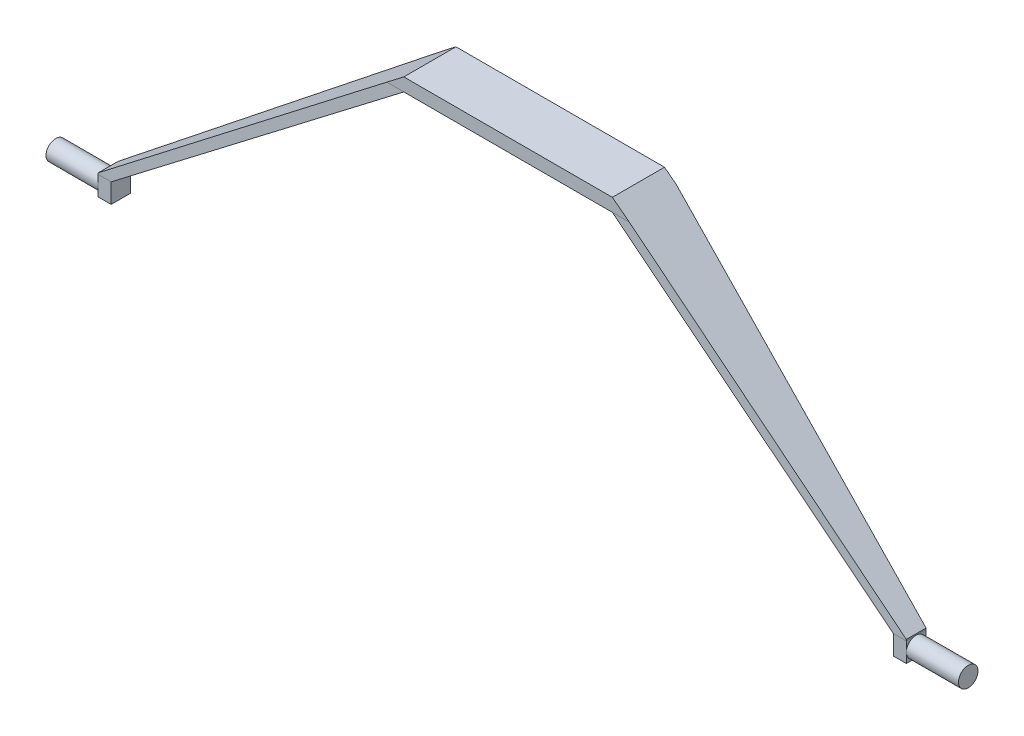
ISO-10303-21;
HEADER;
FILE_DESCRIPTION(('STEP AP214'),'2;1');
FILE_NAME('part.step','',(''),(''),'','','');
FILE_SCHEMA(('AUTOMOTIVE_DESIGN { 1 0 10303 214 1 1 1 1 }'));
ENDSEC;
DATA;
#1=APPLICATION_CONTEXT('core data for automotive mechanical design processes');
#2=APPLICATION_PROTOCOL_DEFINITION('international standard','automotive_design',2000,#1);
#3=PRODUCT_CONTEXT('',#1,'mechanical');
#4=PRODUCT('Part','Part','',(#3));
#5=PRODUCT_RELATED_PRODUCT_CATEGORY('part','',(#4));
#6=PRODUCT_DEFINITION_FORMATION('','',#4);
#7=PRODUCT_DEFINITION_CONTEXT('part definition',#1,'design');
#8=PRODUCT_DEFINITION('design','',#6,#7);
#9=PRODUCT_DEFINITION_SHAPE('','',#8);
#10=(LENGTH_UNIT() NAMED_UNIT(*) SI_UNIT(.MILLI.,.METRE.));
#11=(NAMED_UNIT(*) PLANE_ANGLE_UNIT() SI_UNIT($,.RADIAN.));
#12=(NAMED_UNIT(*) SI_UNIT($,.STERADIAN.) SOLID_ANGLE_UNIT());
#13=UNCERTAINTY_MEASURE_WITH_UNIT(LENGTH_MEASURE(1.E-05),#10,'distance_accuracy_value','');
#14=(GEOMETRIC_REPRESENTATION_CONTEXT(3) GLOBAL_UNCERTAINTY_ASSIGNED_CONTEXT((#13)) GLOBAL_UNIT_ASSIGNED_CONTEXT((#10,
#11,#12)) REPRESENTATION_CONTEXT('',''));
#15=CARTESIAN_POINT('',(0.,0.,0.));
#16=DIRECTION('',(0.,0.,1.));
#17=DIRECTION('',(1.,0.,0.));
#18=AXIS2_PLACEMENT_3D('',#15,#16,#17);
#19=CARTESIAN_POINT('',(0.,215.9,11.43));
#20=DIRECTION('',(0.,-1.,0.));
#21=DIRECTION('',(1.,0.,0.));
#22=AXIS2_PLACEMENT_3D('',#19,#20,#21);
#23=PLANE('',#22);
#24=DIRECTION('',(0.,0.,-1.));
#25=VECTOR('',#24,1.);
#26=CARTESIAN_POINT('',(-203.2,215.9,11.43));
#27=LINE('',#26,#25);
#28=CARTESIAN_POINT('',(-203.2,215.9,0.));
#29=VERTEX_POINT('',#28);
#30=CARTESIAN_POINT('',(-203.2,215.9,-100.20306796752));
#31=VERTEX_POINT('',#30);
#32=EDGE_CURVE('E192',#29,#31,#27,.T.);
#33=ORIENTED_EDGE('',*,*,#32,.T.);
#34=DIRECTION('',(-1.,0.,0.));
#35=VECTOR('',#34,1.);
#36=CARTESIAN_POINT('',(889.072484025787,215.9,-100.20306796752));
#37=LINE('',#36,#35);
#38=CARTESIAN_POINT('',(203.2,215.9,-100.20306796752));
#39=VERTEX_POINT('',#38);
#40=EDGE_CURVE('E172',#39,#31,#37,.T.);
#41=ORIENTED_EDGE('',*,*,#40,.F.);
#42=DIRECTION('',(0.,0.,-1.));
#43=VECTOR('',#42,1.);
#44=CARTESIAN_POINT('',(203.2,215.9,11.43));
#45=LINE('',#44,#43);
#46=CARTESIAN_POINT('',(203.2,215.9,0.));
#47=VERTEX_POINT('',#46);
#48=EDGE_CURVE('E11',#47,#39,#45,.T.);
#49=ORIENTED_EDGE('',*,*,#48,.F.);
#50=DIRECTION('',(1.,0.,0.));
#51=VECTOR('',#50,1.);
#52=CARTESIAN_POINT('',(889.072484025788,215.9,0.));
#53=LINE('',#52,#51);
#54=EDGE_CURVE('E200',#29,#47,#53,.T.);
#55=ORIENTED_EDGE('',*,*,#54,.F.);
#56=EDGE_LOOP('',(#33,#41,#49,#55));
#57=FACE_BOUND('',#56,.T.);
#58=ADVANCED_FACE('F41',(#57),#23,.T.);
#59=CARTESIAN_POINT('',(178.608653813682,234.620555922852,11.43));
#60=DIRECTION('',(-0.605721594983422,-0.795676661320878,0.));
#61=DIRECTION('',(0.795676661320878,-0.605721594983422,0.));
#62=AXIS2_PLACEMENT_3D('',#59,#60,#61);
#63=PLANE('',#62);
#64=ORIENTED_EDGE('',*,*,#48,.T.);
#65=DIRECTION('',(-0.791351832413663,0.602429249749417,-0.104121450152652));
#66=VECTOR('',#65,1.);
#67=CARTESIAN_POINT('',(841.604368216817,-270.09554436941,-16.2055514649283));
#68=LINE('',#67,#66);
#69=CARTESIAN_POINT('',(762.071663752112,-209.55,-26.67));
#70=VERTEX_POINT('',#69);
#71=EDGE_CURVE('E179',#70,#39,#68,.T.);
#72=ORIENTED_EDGE('',*,*,#71,.F.);
#73=DIRECTION('',(0.,0.,-1.));
#74=VECTOR('',#73,1.);
#75=CARTESIAN_POINT('',(762.071663752112,-209.55,11.43));
#76=LINE('',#75,#74);
#77=CARTESIAN_POINT('',(762.071663752112,-209.55,11.43));
#78=VERTEX_POINT('',#77);
#79=EDGE_CURVE('E49',#78,#70,#76,.T.);
#80=ORIENTED_EDGE('',*,*,#79,.F.);
#81=DIRECTION('',(0.795571328940657,-0.605641409022903,0.0162709632274809));
#82=VECTOR('',#81,1.);
#83=CARTESIAN_POINT('',(842.454767838912,-270.742924694243,13.0739890216364));
#84=LINE('',#83,#82);
#85=EDGE_CURVE('E267',#47,#78,#84,.T.);
#86=ORIENTED_EDGE('',*,*,#85,.F.);
#87=EDGE_LOOP('',(#64,#72,#80,#86));
#88=FACE_BOUND('',#87,.T.);
#89=ADVANCED_FACE('F266',(#88),#63,.T.);
#90=CARTESIAN_POINT('',(787.4,0.,11.43));
#91=DIRECTION('',(-1.,0.,0.));
#92=DIRECTION('',(0.,0.,1.));
#93=AXIS2_PLACEMENT_3D('',#90,#91,#92);
#94=PLANE('',#93);
#95=DIRECTION('',(0.,0.985390376076013,-0.170310911972118));
#96=VECTOR('',#95,1.);
#97=CARTESIAN_POINT('',(787.4,-209.55,-26.67));
#98=LINE('',#97,#96);
#99=CARTESIAN_POINT('',(787.4,-209.55,-26.67));
#100=VERTEX_POINT('',#99);
#101=CARTESIAN_POINT('',(787.4,-207.01,-27.1090033908509));
#102=VERTEX_POINT('',#101);
#103=EDGE_CURVE('E270',#100,#102,#98,.T.);
#104=ORIENTED_EDGE('',*,*,#103,.T.);
#105=DIRECTION('',(0.,0.,-1.));
#106=VECTOR('',#105,1.);
#107=CARTESIAN_POINT('',(787.4,-207.01,11.43));
#108=LINE('',#107,#106);
#109=CARTESIAN_POINT('',(787.4,-207.01,11.3617611940298));
#110=VERTEX_POINT('',#109);
#111=EDGE_CURVE('E237',#110,#102,#108,.T.);
#112=ORIENTED_EDGE('',*,*,#111,.F.);
#113=DIRECTION('',(0.,-0.999639313080089,0.0268559815454352));
#114=VECTOR('',#113,1.);
#115=CARTESIAN_POINT('',(787.4,-209.55,11.43));
#116=LINE('',#115,#114);
#117=CARTESIAN_POINT('',(787.4,-209.55,11.43));
#118=VERTEX_POINT('',#117);
#119=EDGE_CURVE('E309',#110,#118,#116,.T.);
#120=ORIENTED_EDGE('',*,*,#119,.T.);
#121=DIRECTION('',(0.,0.,-1.));
#122=VECTOR('',#121,1.);
#123=CARTESIAN_POINT('',(787.4,-209.55,11.43));
#124=LINE('',#123,#122);
#125=EDGE_CURVE('E241',#118,#100,#124,.T.);
#126=ORIENTED_EDGE('',*,*,#125,.T.);
#127=EDGE_LOOP('',(#104,#112,#120,#126));
#128=FACE_BOUND('',#127,.T.);
#129=ADVANCED_FACE('F441',(#128),#94,.F.);
#130=CARTESIAN_POINT('',(191.85340904021,250.007275236534,11.43));
#131=DIRECTION('',(-0.608793543514713,-0.793328696931353,0.));
#132=DIRECTION('',(0.793328696931353,-0.608793543514713,0.));
#133=AXIS2_PLACEMENT_3D('',#130,#131,#132);
#134=PLANE('',#133);
#135=DIRECTION('',(-0.788973141974178,0.605451128514967,-0.104643739532502));
#136=VECTOR('',#135,1.);
#137=CARTESIAN_POINT('',(851.938511109871,-256.536292221271,-18.5490781068317));
#138=LINE('',#137,#136);
#139=CARTESIAN_POINT('',(225.766825324947,223.982414478899,-101.6));
#140=VERTEX_POINT('',#139);
#141=EDGE_CURVE('E278',#102,#140,#138,.T.);
#142=ORIENTED_EDGE('',*,*,#141,.T.);
#143=DIRECTION('',(-0.793328696931354,0.608793543514713,0.));
#144=VECTOR('',#143,1.);
#145=CARTESIAN_POINT('',(191.85340904021,250.007275236534,-101.6));
#146=LINE('',#145,#144);
#147=CARTESIAN_POINT('',(203.2,241.3,-101.6));
#148=VERTEX_POINT('',#147);
#149=EDGE_CURVE('E340',#140,#148,#146,.T.);
#150=ORIENTED_EDGE('',*,*,#149,.T.);
#151=DIRECTION('',(0.,0.,-1.));
#152=VECTOR('',#151,1.);
#153=CARTESIAN_POINT('',(203.2,241.3,11.43));
#154=LINE('',#153,#152);
#155=CARTESIAN_POINT('',(203.2,241.3,0.));
#156=VERTEX_POINT('',#155);
#157=EDGE_CURVE('E233',#156,#148,#154,.T.);
#158=ORIENTED_EDGE('',*,*,#157,.F.);
#159=DIRECTION('',(0.793328696931353,-0.608793543514713,0.));
#160=VECTOR('',#159,1.);
#161=CARTESIAN_POINT('',(634.86785428069,-89.9581577414864,0.));
#162=LINE('',#161,#160);
#163=CARTESIAN_POINT('',(236.299150141643,215.9,0.));
#164=VERTEX_POINT('',#163);
#165=EDGE_CURVE('E301',#156,#164,#162,.T.);
#166=ORIENTED_EDGE('',*,*,#165,.T.);
#167=DIRECTION('',(0.793222607645185,-0.608712131519023,0.0163534602497648));
#168=VECTOR('',#167,1.);
#169=CARTESIAN_POINT('',(852.599850516971,-257.043798331502,12.7059527909956));
#170=LINE('',#169,#168);
#171=EDGE_CURVE('E305',#164,#110,#170,.T.);
#172=ORIENTED_EDGE('',*,*,#171,.T.);
#173=ORIENTED_EDGE('',*,*,#111,.T.);
#174=EDGE_LOOP('',(#142,#150,#158,#166,#172,#173));
#175=FACE_BOUND('',#174,.T.);
#176=ADVANCED_FACE('F423',(#175),#134,.F.);
#177=CARTESIAN_POINT('',(-191.85340904021,250.007275236534,11.43));
#178=DIRECTION('',(-0.608793543514713,0.793328696931354,0.));
#179=DIRECTION('',(-0.793328696931354,-0.608793543514713,0.));
#180=AXIS2_PLACEMENT_3D('',#177,#178,#179);
#181=PLANE('',#180);
#182=DIRECTION('',(0.793328696931354,0.608793543514713,0.));
#183=VECTOR('',#182,1.);
#184=CARTESIAN_POINT('',(-191.85340904021,250.007275236534,-101.6));
#185=LINE('',#184,#183);
#186=CARTESIAN_POINT('',(-225.766825324947,223.982414478899,-101.6));
#187=VERTEX_POINT('',#186);
#188=CARTESIAN_POINT('',(-203.2,241.3,-101.6));
#189=VERTEX_POINT('',#188);
#190=EDGE_CURVE('E351',#187,#189,#185,.T.);
#191=ORIENTED_EDGE('',*,*,#190,.F.);
#192=DIRECTION('',(-0.788973141974178,-0.605451128514967,0.104643739532502));
#193=VECTOR('',#192,1.);
#194=CARTESIAN_POINT('',(-851.938511109871,-256.536292221271,-18.5490781068318));
#195=LINE('',#194,#193);
#196=CARTESIAN_POINT('',(-787.4,-207.01,-27.109003390851));
#197=VERTEX_POINT('',#196);
#198=EDGE_CURVE('E56',#187,#197,#195,.T.);
#199=ORIENTED_EDGE('',*,*,#198,.T.);
#200=DIRECTION('',(0.,0.,-1.));
#201=VECTOR('',#200,1.);
#202=CARTESIAN_POINT('',(-787.4,-207.01,11.43));
#203=LINE('',#202,#201);
#204=CARTESIAN_POINT('',(-787.4,-207.01,11.3617611940298));
#205=VERTEX_POINT('',#204);
#206=EDGE_CURVE('E225',#205,#197,#203,.T.);
#207=ORIENTED_EDGE('',*,*,#206,.F.);
#208=DIRECTION('',(0.793222607645185,0.608712131519023,-0.0163534602497648));
#209=VECTOR('',#208,1.);
#210=CARTESIAN_POINT('',(-852.599850516971,-257.043798331502,12.7059527909955));
#211=LINE('',#210,#209);
#212=CARTESIAN_POINT('',(-236.299150141643,215.9,0.));
#213=VERTEX_POINT('',#212);
#214=EDGE_CURVE('E295',#205,#213,#211,.T.);
#215=ORIENTED_EDGE('',*,*,#214,.T.);
#216=DIRECTION('',(0.793328696931354,0.608793543514713,0.));
#217=VECTOR('',#216,1.);
#218=CARTESIAN_POINT('',(-634.86785428069,-89.9581577414863,0.));
#219=LINE('',#218,#217);
#220=CARTESIAN_POINT('',(-203.2,241.3,0.));
#221=VERTEX_POINT('',#220);
#222=EDGE_CURVE('E269',#213,#221,#219,.T.);
#223=ORIENTED_EDGE('',*,*,#222,.T.);
#224=DIRECTION('',(0.,0.,-1.));
#225=VECTOR('',#224,1.);
#226=CARTESIAN_POINT('',(-203.2,241.3,11.43));
#227=LINE('',#226,#225);
#228=EDGE_CURVE('E229',#221,#189,#227,.T.);
#229=ORIENTED_EDGE('',*,*,#228,.T.);
#230=EDGE_LOOP('',(#191,#199,#207,#215,#223,#229));
#231=FACE_BOUND('',#230,.T.);
#232=ADVANCED_FACE('F477',(#231),#181,.T.);
#233=CARTESIAN_POINT('',(-787.003065002281,1.48030426671114,11.43));
#234=DIRECTION('',(-0.999998231040107,0.00188093504833806,0.));
#235=DIRECTION('',(-0.00188093504833806,-0.999998231040108,0.));
#236=AXIS2_PLACEMENT_3D('',#233,#234,#235);
#237=PLANE('',#236);
#238=DIRECTION('',(-0.00188093504833806,-0.999998231040108,0.));
#239=VECTOR('',#238,1.);
#240=CARTESIAN_POINT('',(-787.472023207346,-247.841104205737,-26.67));
#241=LINE('',#240,#239);
#242=CARTESIAN_POINT('',(-787.435831939441,-228.600033698686,-26.67));
#243=VERTEX_POINT('',#242);
#244=CARTESIAN_POINT('',(-787.471663752112,-247.65,-26.67));
#245=VERTEX_POINT('',#244);
#246=EDGE_CURVE('E389',#243,#245,#241,.T.);
#247=ORIENTED_EDGE('',*,*,#246,.T.);
#248=DIRECTION('',(0.,0.,-1.));
#249=VECTOR('',#248,1.);
#250=CARTESIAN_POINT('',(-787.471663752112,-247.65,11.43));
#251=LINE('',#250,#249);
#252=CARTESIAN_POINT('',(-787.471663752112,-247.65,-7.61999999999999));
#253=VERTEX_POINT('',#252);
#254=EDGE_CURVE('E216',#253,#245,#251,.T.);
#255=ORIENTED_EDGE('',*,*,#254,.F.);
#256=CARTESIAN_POINT('',(-787.435831939442,-228.600033698686,-7.62));
#257=DIRECTION('',(-0.999998231040108,0.00188093504833806,0.));
#258=DIRECTION('',(-0.00188093504833806,-0.999998231040108,0.));
#259=AXIS2_PLACEMENT_3D('',#256,#257,#258);
#260=CIRCLE('',#259,19.05);
#261=EDGE_CURVE('E330',#243,#253,#260,.T.);
#262=ORIENTED_EDGE('',*,*,#261,.F.);
#263=EDGE_LOOP('',(#247,#255,#262));
#264=FACE_BOUND('',#263,.T.);
#265=ADVANCED_FACE('F501',(#264),#237,.T.);
#266=CARTESIAN_POINT('',(762.071663752112,0.,11.43));
#267=DIRECTION('',(-1.,0.,0.));
#268=DIRECTION('',(0.,0.,1.));
#269=AXIS2_PLACEMENT_3D('',#266,#267,#268);
#270=PLANE('',#269);
#271=ORIENTED_EDGE('',*,*,#79,.T.);
#272=DIRECTION('',(0.,1.,0.));
#273=VECTOR('',#272,1.);
#274=CARTESIAN_POINT('',(762.071663752112,-247.65,-26.67));
#275=LINE('',#274,#273);
#276=CARTESIAN_POINT('',(762.071663752112,-247.65,-26.67));
#277=VERTEX_POINT('',#276);
#278=EDGE_CURVE('E261',#277,#70,#275,.T.);
#279=ORIENTED_EDGE('',*,*,#278,.F.);
#280=DIRECTION('',(0.,0.,-1.));
#281=VECTOR('',#280,1.);
#282=CARTESIAN_POINT('',(762.071663752112,-247.65,11.43));
#283=LINE('',#282,#281);
#284=CARTESIAN_POINT('',(762.071663752112,-247.65,11.43));
#285=VERTEX_POINT('',#284);
#286=EDGE_CURVE('E250',#285,#277,#283,.T.);
#287=ORIENTED_EDGE('',*,*,#286,.F.);
#288=DIRECTION('',(0.,1.,0.));
#289=VECTOR('',#288,1.);
#290=CARTESIAN_POINT('',(762.071663752112,0.,11.43));
#291=LINE('',#290,#289);
#292=EDGE_CURVE('E263',#285,#78,#291,.T.);
#293=ORIENTED_EDGE('',*,*,#292,.T.);
#294=EDGE_LOOP('',(#271,#279,#287,#293));
#295=FACE_BOUND('',#294,.T.);
#296=ADVANCED_FACE('F259',(#295),#270,.T.);
#297=CARTESIAN_POINT('',(0.,-247.65,11.43));
#298=DIRECTION('',(0.,-1.,0.));
#299=DIRECTION('',(0.,0.,-1.));
#300=AXIS2_PLACEMENT_3D('',#297,#298,#299);
#301=PLANE('',#300);
#302=ORIENTED_EDGE('',*,*,#286,.T.);
#303=DIRECTION('',(-1.,0.,0.));
#304=VECTOR('',#303,1.);
#305=CARTESIAN_POINT('',(889.072484025788,-247.65,-26.67));
#306=LINE('',#305,#304);
#307=CARTESIAN_POINT('',(787.471663752112,-247.65,-26.67));
#308=VERTEX_POINT('',#307);
#309=EDGE_CURVE('E417',#308,#277,#306,.T.);
#310=ORIENTED_EDGE('',*,*,#309,.F.);
#311=DIRECTION('',(0.,0.,-1.));
#312=VECTOR('',#311,1.);
#313=CARTESIAN_POINT('',(787.471663752112,-247.65,11.43));
#314=LINE('',#313,#312);
#315=CARTESIAN_POINT('',(787.471663752112,-247.65,-7.62));
#316=VERTEX_POINT('',#315);
#317=EDGE_CURVE('E245',#316,#308,#314,.T.);
#318=ORIENTED_EDGE('',*,*,#317,.F.);
#319=CARTESIAN_POINT('',(787.471663752112,-247.65,11.43));
#320=VERTEX_POINT('',#319);
#321=EDGE_CURVE('E246',#320,#316,#314,.T.);
#322=ORIENTED_EDGE('',*,*,#321,.F.);
#323=DIRECTION('',(-1.,0.,0.));
#324=VECTOR('',#323,1.);
#325=CARTESIAN_POINT('',(0.,-247.65,11.43));
#326=LINE('',#325,#324);
#327=EDGE_CURVE('E356',#320,#285,#326,.T.);
#328=ORIENTED_EDGE('',*,*,#327,.T.);
#329=EDGE_LOOP('',(#302,#310,#318,#322,#328));
#330=FACE_BOUND('',#329,.T.);
#331=ADVANCED_FACE('F500',(#330),#301,.T.);
#332=CARTESIAN_POINT('',(787.003065002281,1.48030426671114,11.43));
#333=DIRECTION('',(-0.999998231040107,-0.00188093504833806,0.));
#334=DIRECTION('',(0.00188093504833806,-0.999998231040108,0.));
#335=AXIS2_PLACEMENT_3D('',#332,#333,#334);
#336=PLANE('',#335);
#337=DIRECTION('',(-0.00188093504833806,0.999998231040108,0.));
#338=VECTOR('',#337,1.);
#339=CARTESIAN_POINT('',(787.472023207346,-247.841104205737,-26.67));
#340=LINE('',#339,#338);
#341=CARTESIAN_POINT('',(787.435831939441,-228.600033698686,-26.67));
#342=VERTEX_POINT('',#341);
#343=EDGE_CURVE('E184',#342,#100,#340,.T.);
#344=ORIENTED_EDGE('',*,*,#343,.T.);
#345=ORIENTED_EDGE('',*,*,#125,.F.);
#346=DIRECTION('',(-0.00188093504833806,0.999998231040107,0.));
#347=VECTOR('',#346,1.);
#348=CARTESIAN_POINT('',(787.003065002281,1.48030426671114,11.43));
#349=LINE('',#348,#347);
#350=CARTESIAN_POINT('',(787.435831939442,-228.600033698686,11.43));
#351=VERTEX_POINT('',#350);
#352=EDGE_CURVE('E360',#351,#118,#349,.T.);
#353=ORIENTED_EDGE('',*,*,#352,.F.);
#354=CARTESIAN_POINT('',(787.435831939442,-228.600033698686,-7.62));
#355=DIRECTION('',(-0.999998231040108,-0.00188093504833806,0.));
#356=DIRECTION('',(0.00188093504833806,-0.999998231040108,0.));
#357=AXIS2_PLACEMENT_3D('',#354,#355,#356);
#358=CIRCLE('',#357,19.05);
#359=EDGE_CURVE('E335',#351,#342,#358,.T.);
#360=ORIENTED_EDGE('',*,*,#359,.T.);
#361=EDGE_LOOP('',(#344,#345,#353,#360));
#362=FACE_BOUND('',#361,.T.);
#363=ADVANCED_FACE('F452',(#362),#336,.F.);
#364=EDGE_CURVE('E406',#308,#342,#340,.T.);
#365=ORIENTED_EDGE('',*,*,#364,.T.);
#366=EDGE_CURVE('E64',#342,#316,#358,.T.);
#367=ORIENTED_EDGE('',*,*,#366,.T.);
#368=ORIENTED_EDGE('',*,*,#317,.T.);
#369=EDGE_LOOP('',(#365,#367,#368));
#370=FACE_BOUND('',#369,.T.);
#371=ADVANCED_FACE('F458',(#370),#336,.F.);
#372=CARTESIAN_POINT('',(-787.4,0.,11.43));
#373=DIRECTION('',(-1.,0.,0.));
#374=DIRECTION('',(0.,0.,1.));
#375=AXIS2_PLACEMENT_3D('',#372,#373,#374);
#376=PLANE('',#375);
#377=ORIENTED_EDGE('',*,*,#206,.T.);
#378=DIRECTION('',(0.,-0.985390376076013,0.170310911972118));
#379=VECTOR('',#378,1.);
#380=CARTESIAN_POINT('',(-787.4,-209.55,-26.67));
#381=LINE('',#380,#379);
#382=CARTESIAN_POINT('',(-787.4,-209.55,-26.6700000000001));
#383=VERTEX_POINT('',#382);
#384=EDGE_CURVE('E196',#197,#383,#381,.T.);
#385=ORIENTED_EDGE('',*,*,#384,.T.);
#386=DIRECTION('',(0.,0.,-1.));
#387=VECTOR('',#386,1.);
#388=CARTESIAN_POINT('',(-787.4,-209.55,11.43));
#389=LINE('',#388,#387);
#390=CARTESIAN_POINT('',(-787.4,-209.55,11.43));
#391=VERTEX_POINT('',#390);
#392=EDGE_CURVE('E221',#391,#383,#389,.T.);
#393=ORIENTED_EDGE('',*,*,#392,.F.);
#394=DIRECTION('',(0.,0.999639313080089,-0.0268559815454352));
#395=VECTOR('',#394,1.);
#396=CARTESIAN_POINT('',(-787.4,-209.55,11.43));
#397=LINE('',#396,#395);
#398=EDGE_CURVE('E291',#391,#205,#397,.T.);
#399=ORIENTED_EDGE('',*,*,#398,.T.);
#400=EDGE_LOOP('',(#377,#385,#393,#399));
#401=FACE_BOUND('',#400,.T.);
#402=ADVANCED_FACE('F474',(#401),#376,.T.);
#403=CARTESIAN_POINT('',(-178.608653813682,234.620555922852,11.43));
#404=DIRECTION('',(-0.605721594983422,0.795676661320878,0.));
#405=DIRECTION('',(-0.795676661320878,-0.605721594983422,0.));
#406=AXIS2_PLACEMENT_3D('',#403,#404,#405);
#407=PLANE('',#406);
#408=DIRECTION('',(-0.791351832413664,-0.602429249749417,0.104121450152652));
#409=VECTOR('',#408,1.);
#410=CARTESIAN_POINT('',(-841.604368216818,-270.095544369409,-16.2055514649284));
#411=LINE('',#410,#409);
#412=CARTESIAN_POINT('',(-762.071663752112,-209.55,-26.6700000000001));
#413=VERTEX_POINT('',#412);
#414=EDGE_CURVE('E176',#31,#413,#411,.T.);
#415=ORIENTED_EDGE('',*,*,#414,.F.);
#416=ORIENTED_EDGE('',*,*,#32,.F.);
#417=DIRECTION('',(0.795571328940657,0.605641409022902,-0.0162709632274809));
#418=VECTOR('',#417,1.);
#419=CARTESIAN_POINT('',(-842.454767838912,-270.742924694243,13.0739890216364));
#420=LINE('',#419,#418);
#421=CARTESIAN_POINT('',(-762.071663752113,-209.55,11.43));
#422=VERTEX_POINT('',#421);
#423=EDGE_CURVE('E285',#422,#29,#420,.T.);
#424=ORIENTED_EDGE('',*,*,#423,.F.);
#425=DIRECTION('',(0.,0.,-1.));
#426=VECTOR('',#425,1.);
#427=CARTESIAN_POINT('',(-762.071663752112,-209.55,11.43));
#428=LINE('',#427,#426);
#429=EDGE_CURVE('E194',#422,#413,#428,.T.);
#430=ORIENTED_EDGE('',*,*,#429,.T.);
#431=EDGE_LOOP('',(#415,#416,#424,#430));
#432=FACE_BOUND('',#431,.T.);
#433=ADVANCED_FACE('F190',(#432),#407,.F.);
#434=CARTESIAN_POINT('',(0.,0.,-101.6));
#435=DIRECTION('',(0.,0.,1.));
#436=DIRECTION('',(1.,0.,0.));
#437=AXIS2_PLACEMENT_3D('',#434,#435,#436);
#438=PLANE('',#437);
#439=DIRECTION('',(-1.,0.,0.));
#440=VECTOR('',#439,1.);
#441=CARTESIAN_POINT('',(889.072484025788,223.982414478899,-101.6));
#442=LINE('',#441,#440);
#443=EDGE_CURVE('E414',#140,#187,#442,.T.);
#444=ORIENTED_EDGE('',*,*,#443,.T.);
#445=ORIENTED_EDGE('',*,*,#190,.T.);
#446=DIRECTION('',(1.,0.,0.));
#447=VECTOR('',#446,1.);
#448=CARTESIAN_POINT('',(0.,241.3,-101.6));
#449=LINE('',#448,#447);
#450=EDGE_CURVE('E347',#189,#148,#449,.T.);
#451=ORIENTED_EDGE('',*,*,#450,.T.);
#452=ORIENTED_EDGE('',*,*,#149,.F.);
#453=EDGE_LOOP('',(#444,#445,#451,#452));
#454=FACE_BOUND('',#453,.T.);
#455=ADVANCED_FACE('F427',(#454),#438,.F.);
#456=CARTESIAN_POINT('',(0.,241.3,11.43));
#457=DIRECTION('',(0.,1.,0.));
#458=DIRECTION('',(-1.,0.,0.));
#459=AXIS2_PLACEMENT_3D('',#456,#457,#458);
#460=PLANE('',#459);
#461=ORIENTED_EDGE('',*,*,#228,.F.);
#462=DIRECTION('',(-1.,0.,0.));
#463=VECTOR('',#462,1.);
#464=CARTESIAN_POINT('',(889.072484025788,241.3,0.));
#465=LINE('',#464,#463);
#466=EDGE_CURVE('E315',#156,#221,#465,.T.);
#467=ORIENTED_EDGE('',*,*,#466,.F.);
#468=ORIENTED_EDGE('',*,*,#157,.T.);
#469=ORIENTED_EDGE('',*,*,#450,.F.);
#470=EDGE_LOOP('',(#461,#467,#468,#469));
#471=FACE_BOUND('',#470,.T.);
#472=ADVANCED_FACE('F432',(#471),#460,.T.);
#473=CARTESIAN_POINT('',(0.,0.,11.43));
#474=DIRECTION('',(0.,0.,1.));
#475=DIRECTION('',(1.,0.,0.));
#476=AXIS2_PLACEMENT_3D('',#473,#474,#475);
#477=PLANE('',#476);
#478=ORIENTED_EDGE('',*,*,#352,.T.);
#479=DIRECTION('',(-1.,0.,0.));
#480=VECTOR('',#479,1.);
#481=CARTESIAN_POINT('',(889.072484025788,-209.55,11.43));
#482=LINE('',#481,#480);
#483=EDGE_CURVE('E322',#118,#78,#482,.T.);
#484=ORIENTED_EDGE('',*,*,#483,.T.);
#485=ORIENTED_EDGE('',*,*,#292,.F.);
#486=ORIENTED_EDGE('',*,*,#327,.F.);
#487=EDGE_CURVE('E361',#320,#351,#349,.T.);
#488=ORIENTED_EDGE('',*,*,#487,.T.);
#489=EDGE_LOOP('',(#478,#484,#485,#486,#488));
#490=FACE_BOUND('',#489,.T.);
#491=ADVANCED_FACE('F445',(#490),#477,.T.);
#492=ORIENTED_EDGE('',*,*,#321,.T.);
#493=EDGE_CURVE('E331',#316,#351,#358,.T.);
#494=ORIENTED_EDGE('',*,*,#493,.T.);
#495=ORIENTED_EDGE('',*,*,#487,.F.);
#496=EDGE_LOOP('',(#492,#494,#495));
#497=FACE_BOUND('',#496,.T.);
#498=ADVANCED_FACE('F506',(#497),#336,.F.);
#499=EDGE_CURVE('E197',#383,#243,#241,.T.);
#500=ORIENTED_EDGE('',*,*,#499,.T.);
#501=CARTESIAN_POINT('',(-787.435831939442,-228.600033698686,11.43));
#502=VERTEX_POINT('',#501);
#503=EDGE_CURVE('E344',#502,#243,#260,.T.);
#504=ORIENTED_EDGE('',*,*,#503,.F.);
#505=DIRECTION('',(0.00188093504833806,0.999998231040107,0.));
#506=VECTOR('',#505,1.);
#507=CARTESIAN_POINT('',(-787.003065002281,1.48030426671114,11.43));
#508=LINE('',#507,#506);
#509=EDGE_CURVE('E365',#502,#391,#508,.T.);
#510=ORIENTED_EDGE('',*,*,#509,.T.);
#511=ORIENTED_EDGE('',*,*,#392,.T.);
#512=EDGE_LOOP('',(#500,#504,#510,#511));
#513=FACE_BOUND('',#512,.T.);
#514=ADVANCED_FACE('F472',(#513),#237,.T.);
#515=CARTESIAN_POINT('',(-787.471663752112,-247.65,11.43));
#516=VERTEX_POINT('',#515);
#517=EDGE_CURVE('E366',#516,#502,#508,.T.);
#518=ORIENTED_EDGE('',*,*,#517,.T.);
#519=EDGE_CURVE('E341',#253,#502,#260,.T.);
#520=ORIENTED_EDGE('',*,*,#519,.F.);
#521=EDGE_CURVE('E217',#516,#253,#251,.T.);
#522=ORIENTED_EDGE('',*,*,#521,.F.);
#523=EDGE_LOOP('',(#518,#520,#522));
#524=FACE_BOUND('',#523,.T.);
#525=ADVANCED_FACE('F516',(#524),#237,.T.);
#526=CARTESIAN_POINT('',(0.,-247.65,11.43));
#527=DIRECTION('',(0.,1.,0.));
#528=DIRECTION('',(0.,0.,1.));
#529=AXIS2_PLACEMENT_3D('',#526,#527,#528);
#530=PLANE('',#529);
#531=ORIENTED_EDGE('',*,*,#254,.T.);
#532=DIRECTION('',(1.,0.,0.));
#533=VECTOR('',#532,1.);
#534=CARTESIAN_POINT('',(-889.072484025788,-247.65,-26.67));
#535=LINE('',#534,#533);
#536=CARTESIAN_POINT('',(-762.071663752112,-247.65,-26.67));
#537=VERTEX_POINT('',#536);
#538=EDGE_CURVE('E382',#245,#537,#535,.T.);
#539=ORIENTED_EDGE('',*,*,#538,.T.);
#540=DIRECTION('',(0.,0.,-1.));
#541=VECTOR('',#540,1.);
#542=CARTESIAN_POINT('',(-762.071663752112,-247.65,11.43));
#543=LINE('',#542,#541);
#544=CARTESIAN_POINT('',(-762.071663752112,-247.65,11.43));
#545=VERTEX_POINT('',#544);
#546=EDGE_CURVE('E206',#545,#537,#543,.T.);
#547=ORIENTED_EDGE('',*,*,#546,.F.);
#548=DIRECTION('',(1.,0.,0.));
#549=VECTOR('',#548,1.);
#550=CARTESIAN_POINT('',(0.,-247.65,11.43));
#551=LINE('',#550,#549);
#552=EDGE_CURVE('E209',#516,#545,#551,.T.);
#553=ORIENTED_EDGE('',*,*,#552,.F.);
#554=ORIENTED_EDGE('',*,*,#521,.T.);
#555=EDGE_LOOP('',(#531,#539,#547,#553,#554));
#556=FACE_BOUND('',#555,.T.);
#557=ADVANCED_FACE('F381',(#556),#530,.F.);
#558=CARTESIAN_POINT('',(-762.071663752112,0.,11.43));
#559=DIRECTION('',(-1.,0.,0.));
#560=DIRECTION('',(0.,0.,1.));
#561=AXIS2_PLACEMENT_3D('',#558,#559,#560);
#562=PLANE('',#561);
#563=ORIENTED_EDGE('',*,*,#546,.T.);
#564=DIRECTION('',(0.,-1.,0.));
#565=VECTOR('',#564,1.);
#566=CARTESIAN_POINT('',(-762.071663752112,-247.65,-26.67));
#567=LINE('',#566,#565);
#568=EDGE_CURVE('E386',#413,#537,#567,.T.);
#569=ORIENTED_EDGE('',*,*,#568,.F.);
#570=ORIENTED_EDGE('',*,*,#429,.F.);
#571=DIRECTION('',(0.,1.,0.));
#572=VECTOR('',#571,1.);
#573=CARTESIAN_POINT('',(-762.071663752112,0.,11.43));
#574=LINE('',#573,#572);
#575=EDGE_CURVE('E202',#545,#422,#574,.T.);
#576=ORIENTED_EDGE('',*,*,#575,.F.);
#577=EDGE_LOOP('',(#563,#569,#570,#576));
#578=FACE_BOUND('',#577,.T.);
#579=ADVANCED_FACE('F385',(#578),#562,.F.);
#580=DIRECTION('',(1.,0.,0.));
#581=VECTOR('',#580,1.);
#582=CARTESIAN_POINT('',(-889.072484025788,-209.55,11.43));
#583=LINE('',#582,#581);
#584=EDGE_CURVE('E275',#391,#422,#583,.T.);
#585=ORIENTED_EDGE('',*,*,#584,.F.);
#586=ORIENTED_EDGE('',*,*,#509,.F.);
#587=ORIENTED_EDGE('',*,*,#517,.F.);
#588=ORIENTED_EDGE('',*,*,#552,.T.);
#589=ORIENTED_EDGE('',*,*,#575,.T.);
#590=EDGE_LOOP('',(#585,#586,#587,#588,#589));
#591=FACE_BOUND('',#590,.T.);
#592=ADVANCED_FACE('F375',(#591),#477,.T.);
#593=CARTESIAN_POINT('',(-889.035652213117,-228.408930697775,-7.62));
#594=DIRECTION('',(0.999998231040107,-0.00188093504833806,0.));
#595=DIRECTION('',(0.00188093504833806,0.999998231040108,0.));
#596=AXIS2_PLACEMENT_3D('',#593,#594,#595);
#597=CYLINDRICAL_SURFACE('',#596,19.05);
#598=CARTESIAN_POINT('',(-889.035652213117,-228.408930697775,-7.62));
#599=DIRECTION('',(-0.999998231040108,0.00188093504833806,0.));
#600=DIRECTION('',(-0.00188093504833806,-0.999998231040108,0.));
#601=AXIS2_PLACEMENT_3D('',#598,#599,#600);
#602=CIRCLE('',#601,19.05);
#603=CARTESIAN_POINT('',(-889.071484025788,-247.458896999089,-7.62));
#604=VERTEX_POINT('',#603);
#605=EDGE_CURVE('E336',#604,#604,#602,.T.);
#606=ORIENTED_EDGE('',*,*,#605,.F.);
#607=EDGE_LOOP('',(#606));
#608=FACE_BOUND('',#607,.T.);
#609=ORIENTED_EDGE('',*,*,#519,.T.);
#610=ORIENTED_EDGE('',*,*,#503,.T.);
#611=ORIENTED_EDGE('',*,*,#261,.T.);
#612=EDGE_LOOP('',(#609,#610,#611));
#613=FACE_BOUND('',#612,.T.);
#614=ADVANCED_FACE('F528',(#608,#613),#597,.T.);
#615=CARTESIAN_POINT('',(-889.035652213117,-228.408930697775,-7.62));
#616=DIRECTION('',(-0.999998231040108,0.00188093504833806,0.));
#617=DIRECTION('',(-0.00188093504833806,-0.999998231040108,0.));
#618=AXIS2_PLACEMENT_3D('',#615,#616,#617);
#619=PLANE('',#618);
#620=ORIENTED_EDGE('',*,*,#605,.T.);
#621=EDGE_LOOP('',(#620));
#622=FACE_BOUND('',#621,.T.);
#623=ADVANCED_FACE('F533',(#622),#619,.T.);
#624=CARTESIAN_POINT('',(889.035652213117,-228.408930697775,-7.62));
#625=DIRECTION('',(-0.999998231040107,-0.00188093504833806,0.));
#626=DIRECTION('',(0.00188093504833806,-0.999998231040108,0.));
#627=AXIS2_PLACEMENT_3D('',#624,#625,#626);
#628=CYLINDRICAL_SURFACE('',#627,19.05);
#629=CARTESIAN_POINT('',(889.035652213117,-228.408930697775,-7.62));
#630=DIRECTION('',(-0.999998231040108,-0.00188093504833806,0.));
#631=DIRECTION('',(0.00188093504833806,-0.999998231040108,0.));
#632=AXIS2_PLACEMENT_3D('',#629,#630,#631);
#633=CIRCLE('',#632,19.05);
#634=CARTESIAN_POINT('',(889.071484025788,-247.458896999089,-7.62));
#635=VERTEX_POINT('',#634);
#636=EDGE_CURVE('E326',#635,#635,#633,.T.);
#637=ORIENTED_EDGE('',*,*,#636,.T.);
#638=EDGE_LOOP('',(#637));
#639=FACE_BOUND('',#638,.T.);
#640=ORIENTED_EDGE('',*,*,#493,.F.);
#641=ORIENTED_EDGE('',*,*,#366,.F.);
#642=ORIENTED_EDGE('',*,*,#359,.F.);
#643=EDGE_LOOP('',(#640,#641,#642));
#644=FACE_BOUND('',#643,.T.);
#645=ADVANCED_FACE('F461',(#639,#644),#628,.T.);
#646=CARTESIAN_POINT('',(889.035652213117,-228.408930697775,-7.62));
#647=DIRECTION('',(0.999998231040108,0.00188093504833806,0.));
#648=DIRECTION('',(0.00188093504833806,-0.999998231040108,0.));
#649=AXIS2_PLACEMENT_3D('',#646,#647,#648);
#650=PLANE('',#649);
#651=ORIENTED_EDGE('',*,*,#636,.F.);
#652=EDGE_LOOP('',(#651));
#653=FACE_BOUND('',#652,.T.);
#654=ADVANCED_FACE('F540',(#653),#650,.T.);
#655=CARTESIAN_POINT('',(889.072484025788,-209.55,11.43));
#656=DIRECTION('',(0.,0.0268559815454352,0.999639313080089));
#657=DIRECTION('',(0.,-0.999639313080089,0.0268559815454352));
#658=AXIS2_PLACEMENT_3D('',#655,#656,#657);
#659=PLANE('',#658);
#660=ORIENTED_EDGE('',*,*,#85,.T.);
#661=ORIENTED_EDGE('',*,*,#483,.F.);
#662=ORIENTED_EDGE('',*,*,#119,.F.);
#663=ORIENTED_EDGE('',*,*,#171,.F.);
#664=DIRECTION('',(-1.,0.,0.));
#665=VECTOR('',#664,1.);
#666=CARTESIAN_POINT('',(889.072484025788,215.9,0.));
#667=LINE('',#666,#665);
#668=EDGE_CURVE('E318',#164,#47,#667,.T.);
#669=ORIENTED_EDGE('',*,*,#668,.T.);
#670=EDGE_LOOP('',(#660,#661,#662,#663,#669));
#671=FACE_BOUND('',#670,.T.);
#672=ADVANCED_FACE('F438',(#671),#659,.T.);
#673=CARTESIAN_POINT('',(889.072484025788,241.3,0.));
#674=DIRECTION('',(0.,0.,1.));
#675=DIRECTION('',(1.,0.,0.));
#676=AXIS2_PLACEMENT_3D('',#673,#674,#675);
#677=PLANE('',#676);
#678=ORIENTED_EDGE('',*,*,#466,.T.);
#679=ORIENTED_EDGE('',*,*,#222,.F.);
#680=DIRECTION('',(1.,0.,0.));
#681=VECTOR('',#680,1.);
#682=CARTESIAN_POINT('',(-889.072484025788,215.9,0.));
#683=LINE('',#682,#681);
#684=EDGE_CURVE('E282',#213,#29,#683,.T.);
#685=ORIENTED_EDGE('',*,*,#684,.T.);
#686=ORIENTED_EDGE('',*,*,#54,.T.);
#687=ORIENTED_EDGE('',*,*,#668,.F.);
#688=ORIENTED_EDGE('',*,*,#165,.F.);
#689=EDGE_LOOP('',(#678,#679,#685,#686,#687,#688));
#690=FACE_BOUND('',#689,.T.);
#691=ADVANCED_FACE('F436',(#690),#677,.T.);
#692=CARTESIAN_POINT('',(-889.072484025788,-209.55,11.43));
#693=DIRECTION('',(0.,-0.0268559815454352,-0.999639313080089));
#694=DIRECTION('',(0.,0.999639313080089,-0.0268559815454352));
#695=AXIS2_PLACEMENT_3D('',#692,#693,#694);
#696=PLANE('',#695);
#697=ORIENTED_EDGE('',*,*,#398,.F.);
#698=ORIENTED_EDGE('',*,*,#584,.T.);
#699=ORIENTED_EDGE('',*,*,#423,.T.);
#700=ORIENTED_EDGE('',*,*,#684,.F.);
#701=ORIENTED_EDGE('',*,*,#214,.F.);
#702=EDGE_LOOP('',(#697,#698,#699,#700,#701));
#703=FACE_BOUND('',#702,.T.);
#704=ADVANCED_FACE('F480',(#703),#696,.F.);
#705=CARTESIAN_POINT('',(889.072484025788,-247.65,-26.67));
#706=DIRECTION('',(0.,0.,-1.));
#707=DIRECTION('',(0.,1.,0.));
#708=AXIS2_PLACEMENT_3D('',#705,#706,#707);
#709=PLANE('',#708);
#710=ORIENTED_EDGE('',*,*,#278,.T.);
#711=DIRECTION('',(-1.,0.,0.));
#712=VECTOR('',#711,1.);
#713=CARTESIAN_POINT('',(889.072484025788,-209.55,-26.67));
#714=LINE('',#713,#712);
#715=EDGE_CURVE('E411',#100,#70,#714,.T.);
#716=ORIENTED_EDGE('',*,*,#715,.F.);
#717=ORIENTED_EDGE('',*,*,#343,.F.);
#718=ORIENTED_EDGE('',*,*,#364,.F.);
#719=ORIENTED_EDGE('',*,*,#309,.T.);
#720=EDGE_LOOP('',(#710,#716,#717,#718,#719));
#721=FACE_BOUND('',#720,.T.);
#722=ADVANCED_FACE('F456',(#721),#709,.T.);
#723=CARTESIAN_POINT('',(889.072484025788,-209.55,-26.67));
#724=DIRECTION('',(0.,-0.170310911972118,-0.985390376076013));
#725=DIRECTION('',(0.,0.985390376076013,-0.170310911972118));
#726=AXIS2_PLACEMENT_3D('',#723,#724,#725);
#727=PLANE('',#726);
#728=ORIENTED_EDGE('',*,*,#40,.T.);
#729=ORIENTED_EDGE('',*,*,#414,.T.);
#730=DIRECTION('',(1.,0.,0.));
#731=VECTOR('',#730,1.);
#732=CARTESIAN_POINT('',(-889.072484025788,-209.55,-26.67));
#733=LINE('',#732,#731);
#734=EDGE_CURVE('E185',#383,#413,#733,.T.);
#735=ORIENTED_EDGE('',*,*,#734,.F.);
#736=ORIENTED_EDGE('',*,*,#384,.F.);
#737=ORIENTED_EDGE('',*,*,#198,.F.);
#738=ORIENTED_EDGE('',*,*,#443,.F.);
#739=ORIENTED_EDGE('',*,*,#141,.F.);
#740=ORIENTED_EDGE('',*,*,#103,.F.);
#741=ORIENTED_EDGE('',*,*,#715,.T.);
#742=ORIENTED_EDGE('',*,*,#71,.T.);
#743=EDGE_LOOP('',(#728,#729,#735,#736,#737,#738,#739,#740,#741,#742));
#744=FACE_BOUND('',#743,.T.);
#745=ADVANCED_FACE('F174',(#744),#727,.T.);
#746=CARTESIAN_POINT('',(-889.072484025788,-247.65,-26.67));
#747=DIRECTION('',(0.,0.,1.));
#748=DIRECTION('',(0.,-1.,0.));
#749=AXIS2_PLACEMENT_3D('',#746,#747,#748);
#750=PLANE('',#749);
#751=ORIENTED_EDGE('',*,*,#734,.T.);
#752=ORIENTED_EDGE('',*,*,#568,.T.);
#753=ORIENTED_EDGE('',*,*,#538,.F.);
#754=ORIENTED_EDGE('',*,*,#246,.F.);
#755=ORIENTED_EDGE('',*,*,#499,.F.);
#756=EDGE_LOOP('',(#751,#752,#753,#754,#755));
#757=FACE_BOUND('',#756,.T.);
#758=ADVANCED_FACE('F690',(#757),#750,.F.);
#759=CLOSED_SHELL('',(#58,#89,#129,#176,#232,#265,#296,#331,#363,#371,#402,#433,#455,#472,#491,
#498,#514,#525,#557,#579,#592,#614,#623,#645,#654,#672,#691,#704,#722,#745,#758));
#760=MANIFOLD_SOLID_BREP('B2',#759);
#761=ADVANCED_BREP_SHAPE_REPRESENTATION('',(#18,#760),#14);
#762=SHAPE_DEFINITION_REPRESENTATION(#9,#761);
ENDSEC;
END-ISO-10303-21;
